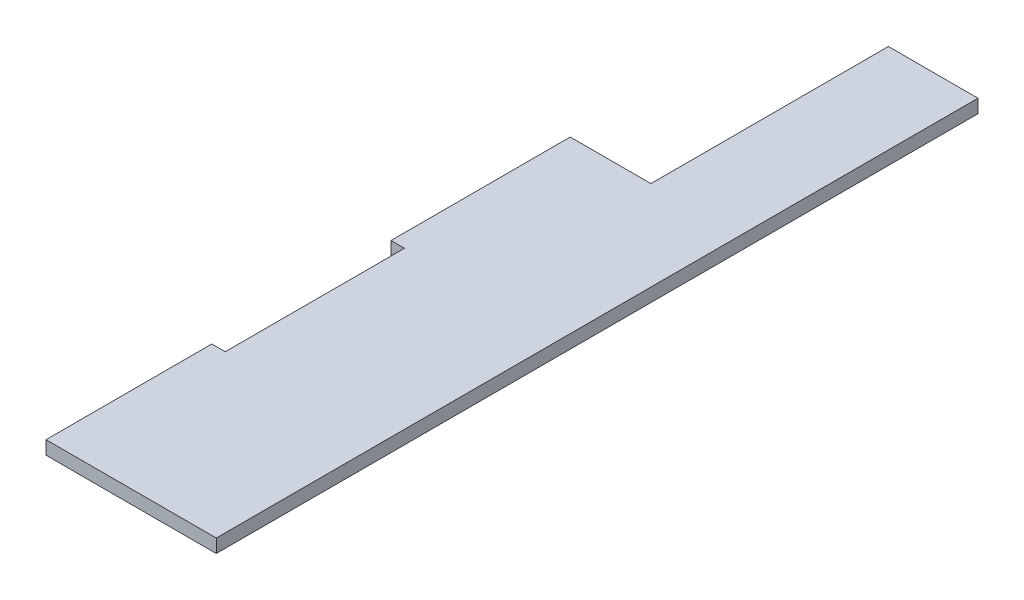
ISO-10303-21;
HEADER;
FILE_DESCRIPTION(('STEP AP214'),'2;1');
FILE_NAME('part.step','',(''),(''),'','','');
FILE_SCHEMA(('AUTOMOTIVE_DESIGN { 1 0 10303 214 1 1 1 1 }'));
ENDSEC;
DATA;
#1=APPLICATION_CONTEXT('core data for automotive mechanical design processes');
#2=APPLICATION_PROTOCOL_DEFINITION('international standard','automotive_design',2000,#1);
#3=PRODUCT_CONTEXT('',#1,'mechanical');
#4=PRODUCT('Part','Part','',(#3));
#5=PRODUCT_RELATED_PRODUCT_CATEGORY('part','',(#4));
#6=PRODUCT_DEFINITION_FORMATION('','',#4);
#7=PRODUCT_DEFINITION_CONTEXT('part definition',#1,'design');
#8=PRODUCT_DEFINITION('design','',#6,#7);
#9=PRODUCT_DEFINITION_SHAPE('','',#8);
#10=(LENGTH_UNIT() NAMED_UNIT(*) SI_UNIT(.MILLI.,.METRE.));
#11=(NAMED_UNIT(*) PLANE_ANGLE_UNIT() SI_UNIT($,.RADIAN.));
#12=(NAMED_UNIT(*) SI_UNIT($,.STERADIAN.) SOLID_ANGLE_UNIT());
#13=UNCERTAINTY_MEASURE_WITH_UNIT(LENGTH_MEASURE(1.E-05),#10,'distance_accuracy_value','');
#14=(GEOMETRIC_REPRESENTATION_CONTEXT(3) GLOBAL_UNCERTAINTY_ASSIGNED_CONTEXT((#13)) GLOBAL_UNIT_ASSIGNED_CONTEXT((#10,
#11,#12)) REPRESENTATION_CONTEXT('',''));
#15=CARTESIAN_POINT('',(0.,0.,0.));
#16=DIRECTION('',(0.,0.,1.));
#17=DIRECTION('',(1.,0.,0.));
#18=AXIS2_PLACEMENT_3D('',#15,#16,#17);
#19=CARTESIAN_POINT('',(103.125,224.1,101.5));
#20=DIRECTION('',(0.,1.,0.));
#21=DIRECTION('',(-1.,0.,0.));
#22=AXIS2_PLACEMENT_3D('',#19,#20,#21);
#23=PLANE('',#22);
#24=DIRECTION('',(0.,0.,1.));
#25=VECTOR('',#24,1.);
#26=CARTESIAN_POINT('',(0.124999999999993,224.1,0.));
#27=LINE('',#26,#25);
#28=CARTESIAN_POINT('',(0.124999999999991,224.1,133.));
#29=VERTEX_POINT('',#28);
#30=CARTESIAN_POINT('',(0.124999999999991,224.1,170.));
#31=VERTEX_POINT('',#30);
#32=EDGE_CURVE('E145',#29,#31,#27,.T.);
#33=ORIENTED_EDGE('',*,*,#32,.F.);
#34=DIRECTION('',(1.,0.,0.));
#35=VECTOR('',#34,1.);
#36=CARTESIAN_POINT('',(0.124999999999993,224.1,133.));
#37=LINE('',#36,#35);
#38=CARTESIAN_POINT('',(3.125,224.1,133.));
#39=VERTEX_POINT('',#38);
#40=EDGE_CURVE('E139',#29,#39,#37,.T.);
#41=ORIENTED_EDGE('',*,*,#40,.T.);
#42=DIRECTION('',(0.,0.,1.));
#43=VECTOR('',#42,1.);
#44=CARTESIAN_POINT('',(3.125,224.1,188.));
#45=LINE('',#44,#43);
#46=CARTESIAN_POINT('',(3.125,224.1,93.));
#47=VERTEX_POINT('',#46);
#48=EDGE_CURVE('E136',#39,#47,#45,.F.);
#49=ORIENTED_EDGE('',*,*,#48,.T.);
#50=DIRECTION('',(-1.,0.,0.));
#51=VECTOR('',#50,1.);
#52=CARTESIAN_POINT('',(0.124999999999993,224.1,93.));
#53=LINE('',#52,#51);
#54=CARTESIAN_POINT('',(0.12499999999999,224.1,93.));
#55=VERTEX_POINT('',#54);
#56=EDGE_CURVE('E130',#47,#55,#53,.T.);
#57=ORIENTED_EDGE('',*,*,#56,.T.);
#58=DIRECTION('',(0.,0.,1.));
#59=VECTOR('',#58,1.);
#60=CARTESIAN_POINT('',(0.124999999999993,224.1,0.));
#61=LINE('',#60,#59);
#62=CARTESIAN_POINT('',(0.124999999999991,224.1,53.));
#63=VERTEX_POINT('',#62);
#64=EDGE_CURVE('E127',#63,#55,#61,.T.);
#65=ORIENTED_EDGE('',*,*,#64,.F.);
#66=DIRECTION('',(1.,0.,0.));
#67=VECTOR('',#66,1.);
#68=CARTESIAN_POINT('',(0.124999999999993,224.1,53.));
#69=LINE('',#68,#67);
#70=CARTESIAN_POINT('',(18.125,224.1,53.));
#71=VERTEX_POINT('',#70);
#72=EDGE_CURVE('E120',#63,#71,#69,.T.);
#73=ORIENTED_EDGE('',*,*,#72,.T.);
#74=DIRECTION('',(0.,0.,1.));
#75=VECTOR('',#74,1.);
#76=CARTESIAN_POINT('',(18.125,224.1,188.));
#77=LINE('',#76,#75);
#78=CARTESIAN_POINT('',(18.125,224.1,0.));
#79=VERTEX_POINT('',#78);
#80=EDGE_CURVE('E118',#71,#79,#77,.F.);
#81=ORIENTED_EDGE('',*,*,#80,.T.);
#82=DIRECTION('',(-1.,0.,0.));
#83=VECTOR('',#82,1.);
#84=CARTESIAN_POINT('',(70.125,224.1,0.));
#85=LINE('',#84,#83);
#86=CARTESIAN_POINT('',(38.125,224.1,0.));
#87=VERTEX_POINT('',#86);
#88=EDGE_CURVE('E98',#87,#79,#85,.T.);
#89=ORIENTED_EDGE('',*,*,#88,.F.);
#90=DIRECTION('',(0.,0.,1.));
#91=VECTOR('',#90,1.);
#92=CARTESIAN_POINT('',(38.125,224.1,188.));
#93=LINE('',#92,#91);
#94=CARTESIAN_POINT('',(38.125,224.1,170.));
#95=VERTEX_POINT('',#94);
#96=EDGE_CURVE('E91',#87,#95,#93,.T.);
#97=ORIENTED_EDGE('',*,*,#96,.T.);
#98=DIRECTION('',(-1.,0.,0.));
#99=VECTOR('',#98,1.);
#100=CARTESIAN_POINT('',(0.124999999999993,224.1,170.));
#101=LINE('',#100,#99);
#102=EDGE_CURVE('E20',#95,#31,#101,.T.);
#103=ORIENTED_EDGE('',*,*,#102,.T.);
#104=EDGE_LOOP('',(#33,#41,#49,#57,#65,#73,#81,#89,#97,#103));
#105=FACE_BOUND('',#104,.T.);
#106=ADVANCED_FACE('F17',(#105),#23,.F.);
#107=CARTESIAN_POINT('',(0.124999999999993,224.1,170.));
#108=DIRECTION('',(0.,0.,-1.));
#109=DIRECTION('',(-1.,0.,0.));
#110=AXIS2_PLACEMENT_3D('',#107,#108,#109);
#111=PLANE('',#110);
#112=DIRECTION('',(0.,1.,0.));
#113=VECTOR('',#112,1.);
#114=CARTESIAN_POINT('',(0.124999999999993,224.1,170.));
#115=LINE('',#114,#113);
#116=CARTESIAN_POINT('',(0.124999999999991,227.1,170.));
#117=VERTEX_POINT('',#116);
#118=EDGE_CURVE('E105',#31,#117,#115,.T.);
#119=ORIENTED_EDGE('',*,*,#118,.F.);
#120=ORIENTED_EDGE('',*,*,#102,.F.);
#121=DIRECTION('',(0.,-1.,0.));
#122=VECTOR('',#121,1.);
#123=CARTESIAN_POINT('',(38.125,225.6,170.));
#124=LINE('',#123,#122);
#125=CARTESIAN_POINT('',(38.125,227.1,170.));
#126=VERTEX_POINT('',#125);
#127=EDGE_CURVE('E100',#95,#126,#124,.F.);
#128=ORIENTED_EDGE('',*,*,#127,.T.);
#129=DIRECTION('',(-1.,0.,0.));
#130=VECTOR('',#129,1.);
#131=CARTESIAN_POINT('',(103.125332644,227.1,170.));
#132=LINE('',#131,#130);
#133=EDGE_CURVE('E147',#117,#126,#132,.F.);
#134=ORIENTED_EDGE('',*,*,#133,.F.);
#135=EDGE_LOOP('',(#119,#120,#128,#134));
#136=FACE_BOUND('',#135,.T.);
#137=ADVANCED_FACE('F102',(#136),#111,.F.);
#138=CARTESIAN_POINT('',(38.125,225.6,188.));
#139=DIRECTION('',(-1.,0.,0.));
#140=DIRECTION('',(0.,-1.,0.));
#141=AXIS2_PLACEMENT_3D('',#138,#139,#140);
#142=PLANE('',#141);
#143=ORIENTED_EDGE('',*,*,#96,.F.);
#144=DIRECTION('',(0.,1.,0.));
#145=VECTOR('',#144,1.);
#146=CARTESIAN_POINT('',(38.125,224.1,0.));
#147=LINE('',#146,#145);
#148=CARTESIAN_POINT('',(38.125,227.1,0.));
#149=VERTEX_POINT('',#148);
#150=EDGE_CURVE('E111',#149,#87,#147,.F.);
#151=ORIENTED_EDGE('',*,*,#150,.F.);
#152=DIRECTION('',(0.,0.,1.));
#153=VECTOR('',#152,1.);
#154=CARTESIAN_POINT('',(38.125,227.1,101.5));
#155=LINE('',#154,#153);
#156=EDGE_CURVE('E109',#126,#149,#155,.F.);
#157=ORIENTED_EDGE('',*,*,#156,.F.);
#158=ORIENTED_EDGE('',*,*,#127,.F.);
#159=EDGE_LOOP('',(#143,#151,#157,#158));
#160=FACE_BOUND('',#159,.T.);
#161=ADVANCED_FACE('F107',(#160),#142,.F.);
#162=CARTESIAN_POINT('',(70.125,224.1,0.));
#163=DIRECTION('',(0.,0.,-1.));
#164=DIRECTION('',(-1.,0.,0.));
#165=AXIS2_PLACEMENT_3D('',#162,#163,#164);
#166=PLANE('',#165);
#167=ORIENTED_EDGE('',*,*,#150,.T.);
#168=ORIENTED_EDGE('',*,*,#88,.T.);
#169=DIRECTION('',(0.,1.,0.));
#170=VECTOR('',#169,1.);
#171=CARTESIAN_POINT('',(18.125,225.6,0.));
#172=LINE('',#171,#170);
#173=CARTESIAN_POINT('',(18.125,227.1,0.));
#174=VERTEX_POINT('',#173);
#175=EDGE_CURVE('E116',#79,#174,#172,.T.);
#176=ORIENTED_EDGE('',*,*,#175,.T.);
#177=DIRECTION('',(-1.,0.,0.));
#178=VECTOR('',#177,1.);
#179=CARTESIAN_POINT('',(103.125332644,227.1,0.));
#180=LINE('',#179,#178);
#181=EDGE_CURVE('E150',#149,#174,#180,.T.);
#182=ORIENTED_EDGE('',*,*,#181,.F.);
#183=EDGE_LOOP('',(#167,#168,#176,#182));
#184=FACE_BOUND('',#183,.T.);
#185=ADVANCED_FACE('F208',(#184),#166,.T.);
#186=CARTESIAN_POINT('',(18.125,225.6,188.));
#187=DIRECTION('',(1.,0.,0.));
#188=DIRECTION('',(0.,1.,0.));
#189=AXIS2_PLACEMENT_3D('',#186,#187,#188);
#190=PLANE('',#189);
#191=DIRECTION('',(0.,1.,0.));
#192=VECTOR('',#191,1.);
#193=CARTESIAN_POINT('',(18.125,227.1,53.));
#194=LINE('',#193,#192);
#195=CARTESIAN_POINT('',(18.125,227.1,53.));
#196=VERTEX_POINT('',#195);
#197=EDGE_CURVE('E122',#71,#196,#194,.T.);
#198=ORIENTED_EDGE('',*,*,#197,.T.);
#199=DIRECTION('',(0.,0.,1.));
#200=VECTOR('',#199,1.);
#201=CARTESIAN_POINT('',(18.125,227.1,101.5));
#202=LINE('',#201,#200);
#203=EDGE_CURVE('E153',#174,#196,#202,.T.);
#204=ORIENTED_EDGE('',*,*,#203,.F.);
#205=ORIENTED_EDGE('',*,*,#175,.F.);
#206=ORIENTED_EDGE('',*,*,#80,.F.);
#207=EDGE_LOOP('',(#198,#204,#205,#206));
#208=FACE_BOUND('',#207,.T.);
#209=ADVANCED_FACE('F204',(#208),#190,.F.);
#210=CARTESIAN_POINT('',(0.124999999999993,227.1,53.));
#211=DIRECTION('',(0.,0.,1.));
#212=DIRECTION('',(1.,0.,0.));
#213=AXIS2_PLACEMENT_3D('',#210,#211,#212);
#214=PLANE('',#213);
#215=DIRECTION('',(-1.,0.,0.));
#216=VECTOR('',#215,1.);
#217=CARTESIAN_POINT('',(103.125332644,227.1,53.));
#218=LINE('',#217,#216);
#219=CARTESIAN_POINT('',(0.124999999999991,227.1,53.));
#220=VERTEX_POINT('',#219);
#221=EDGE_CURVE('E156',#196,#220,#218,.T.);
#222=ORIENTED_EDGE('',*,*,#221,.F.);
#223=ORIENTED_EDGE('',*,*,#197,.F.);
#224=ORIENTED_EDGE('',*,*,#72,.F.);
#225=DIRECTION('',(0.,1.,0.));
#226=VECTOR('',#225,1.);
#227=CARTESIAN_POINT('',(0.124999999999993,224.1,53.));
#228=LINE('',#227,#226);
#229=EDGE_CURVE('E124',#220,#63,#228,.F.);
#230=ORIENTED_EDGE('',*,*,#229,.F.);
#231=EDGE_LOOP('',(#222,#223,#224,#230));
#232=FACE_BOUND('',#231,.T.);
#233=ADVANCED_FACE('F200',(#232),#214,.F.);
#234=CARTESIAN_POINT('',(0.124999999999993,224.1,0.));
#235=DIRECTION('',(-1.,0.,0.));
#236=DIRECTION('',(0.,0.,1.));
#237=AXIS2_PLACEMENT_3D('',#234,#235,#236);
#238=PLANE('',#237);
#239=DIRECTION('',(0.,1.,0.));
#240=VECTOR('',#239,1.);
#241=CARTESIAN_POINT('',(0.124999999999993,224.1,93.));
#242=LINE('',#241,#240);
#243=CARTESIAN_POINT('',(0.124999999999991,227.1,93.));
#244=VERTEX_POINT('',#243);
#245=EDGE_CURVE('E132',#55,#244,#242,.T.);
#246=ORIENTED_EDGE('',*,*,#245,.T.);
#247=DIRECTION('',(0.,0.,1.));
#248=VECTOR('',#247,1.);
#249=CARTESIAN_POINT('',(0.124999999999986,227.1,101.5));
#250=LINE('',#249,#248);
#251=EDGE_CURVE('E159',#220,#244,#250,.T.);
#252=ORIENTED_EDGE('',*,*,#251,.F.);
#253=ORIENTED_EDGE('',*,*,#229,.T.);
#254=ORIENTED_EDGE('',*,*,#64,.T.);
#255=EDGE_LOOP('',(#246,#252,#253,#254));
#256=FACE_BOUND('',#255,.T.);
#257=ADVANCED_FACE('F196',(#256),#238,.T.);
#258=CARTESIAN_POINT('',(0.124999999999993,224.1,93.));
#259=DIRECTION('',(0.,0.,-1.));
#260=DIRECTION('',(-1.,0.,0.));
#261=AXIS2_PLACEMENT_3D('',#258,#259,#260);
#262=PLANE('',#261);
#263=ORIENTED_EDGE('',*,*,#56,.F.);
#264=DIRECTION('',(0.,1.,0.));
#265=VECTOR('',#264,1.);
#266=CARTESIAN_POINT('',(3.125,225.6,93.));
#267=LINE('',#266,#265);
#268=CARTESIAN_POINT('',(3.125,227.1,93.));
#269=VERTEX_POINT('',#268);
#270=EDGE_CURVE('E134',#47,#269,#267,.T.);
#271=ORIENTED_EDGE('',*,*,#270,.T.);
#272=DIRECTION('',(-1.,0.,0.));
#273=VECTOR('',#272,1.);
#274=CARTESIAN_POINT('',(103.125332644,227.1,93.));
#275=LINE('',#274,#273);
#276=EDGE_CURVE('E162',#244,#269,#275,.F.);
#277=ORIENTED_EDGE('',*,*,#276,.F.);
#278=ORIENTED_EDGE('',*,*,#245,.F.);
#279=EDGE_LOOP('',(#263,#271,#277,#278));
#280=FACE_BOUND('',#279,.T.);
#281=ADVANCED_FACE('F193',(#280),#262,.F.);
#282=CARTESIAN_POINT('',(3.125,225.6,188.));
#283=DIRECTION('',(1.,0.,0.));
#284=DIRECTION('',(0.,1.,0.));
#285=AXIS2_PLACEMENT_3D('',#282,#283,#284);
#286=PLANE('',#285);
#287=DIRECTION('',(0.,1.,0.));
#288=VECTOR('',#287,1.);
#289=CARTESIAN_POINT('',(3.125,227.1,133.));
#290=LINE('',#289,#288);
#291=CARTESIAN_POINT('',(3.125,227.1,133.));
#292=VERTEX_POINT('',#291);
#293=EDGE_CURVE('E141',#39,#292,#290,.T.);
#294=ORIENTED_EDGE('',*,*,#293,.T.);
#295=DIRECTION('',(0.,0.,1.));
#296=VECTOR('',#295,1.);
#297=CARTESIAN_POINT('',(3.125,227.1,101.5));
#298=LINE('',#297,#296);
#299=EDGE_CURVE('E165',#269,#292,#298,.T.);
#300=ORIENTED_EDGE('',*,*,#299,.F.);
#301=ORIENTED_EDGE('',*,*,#270,.F.);
#302=ORIENTED_EDGE('',*,*,#48,.F.);
#303=EDGE_LOOP('',(#294,#300,#301,#302));
#304=FACE_BOUND('',#303,.T.);
#305=ADVANCED_FACE('F176',(#304),#286,.F.);
#306=CARTESIAN_POINT('',(0.124999999999993,227.1,133.));
#307=DIRECTION('',(0.,0.,1.));
#308=DIRECTION('',(1.,0.,0.));
#309=AXIS2_PLACEMENT_3D('',#306,#307,#308);
#310=PLANE('',#309);
#311=DIRECTION('',(-1.,0.,0.));
#312=VECTOR('',#311,1.);
#313=CARTESIAN_POINT('',(103.125332644,227.1,133.));
#314=LINE('',#313,#312);
#315=CARTESIAN_POINT('',(0.124999999999991,227.1,133.));
#316=VERTEX_POINT('',#315);
#317=EDGE_CURVE('E26',#292,#316,#314,.T.);
#318=ORIENTED_EDGE('',*,*,#317,.F.);
#319=ORIENTED_EDGE('',*,*,#293,.F.);
#320=ORIENTED_EDGE('',*,*,#40,.F.);
#321=DIRECTION('',(0.,1.,0.));
#322=VECTOR('',#321,1.);
#323=CARTESIAN_POINT('',(0.124999999999993,224.1,133.));
#324=LINE('',#323,#322);
#325=EDGE_CURVE('E35',#316,#29,#324,.F.);
#326=ORIENTED_EDGE('',*,*,#325,.F.);
#327=EDGE_LOOP('',(#318,#319,#320,#326));
#328=FACE_BOUND('',#327,.T.);
#329=ADVANCED_FACE('F173',(#328),#310,.F.);
#330=CARTESIAN_POINT('',(0.124999999999993,224.1,0.));
#331=DIRECTION('',(-1.,0.,0.));
#332=DIRECTION('',(0.,0.,1.));
#333=AXIS2_PLACEMENT_3D('',#330,#331,#332);
#334=PLANE('',#333);
#335=ORIENTED_EDGE('',*,*,#325,.T.);
#336=ORIENTED_EDGE('',*,*,#32,.T.);
#337=ORIENTED_EDGE('',*,*,#118,.T.);
#338=DIRECTION('',(0.,0.,1.));
#339=VECTOR('',#338,1.);
#340=CARTESIAN_POINT('',(0.124999999999986,227.1,101.5));
#341=LINE('',#340,#339);
#342=EDGE_CURVE('E11',#316,#117,#341,.T.);
#343=ORIENTED_EDGE('',*,*,#342,.F.);
#344=EDGE_LOOP('',(#335,#336,#337,#343));
#345=FACE_BOUND('',#344,.T.);
#346=ADVANCED_FACE('F180',(#345),#334,.T.);
#347=CARTESIAN_POINT('',(103.125332644,227.1,101.5));
#348=DIRECTION('',(0.,1.,0.));
#349=DIRECTION('',(-1.,0.,0.));
#350=AXIS2_PLACEMENT_3D('',#347,#348,#349);
#351=PLANE('',#350);
#352=ORIENTED_EDGE('',*,*,#317,.T.);
#353=ORIENTED_EDGE('',*,*,#342,.T.);
#354=ORIENTED_EDGE('',*,*,#133,.T.);
#355=ORIENTED_EDGE('',*,*,#156,.T.);
#356=ORIENTED_EDGE('',*,*,#181,.T.);
#357=ORIENTED_EDGE('',*,*,#203,.T.);
#358=ORIENTED_EDGE('',*,*,#221,.T.);
#359=ORIENTED_EDGE('',*,*,#251,.T.);
#360=ORIENTED_EDGE('',*,*,#276,.T.);
#361=ORIENTED_EDGE('',*,*,#299,.T.);
#362=EDGE_LOOP('',(#352,#353,#354,#355,#356,#357,#358,#359,#360,#361));
#363=FACE_BOUND('',#362,.T.);
#364=ADVANCED_FACE('F170',(#363),#351,.T.);
#365=CLOSED_SHELL('',(#106,#137,#161,#185,#209,#233,#257,#281,#305,#329,#346,#364));
#366=MANIFOLD_SOLID_BREP('B1',#365);
#367=ADVANCED_BREP_SHAPE_REPRESENTATION('',(#18,#366),#14);
#368=SHAPE_DEFINITION_REPRESENTATION(#9,#367);
ENDSEC;
END-ISO-10303-21;
